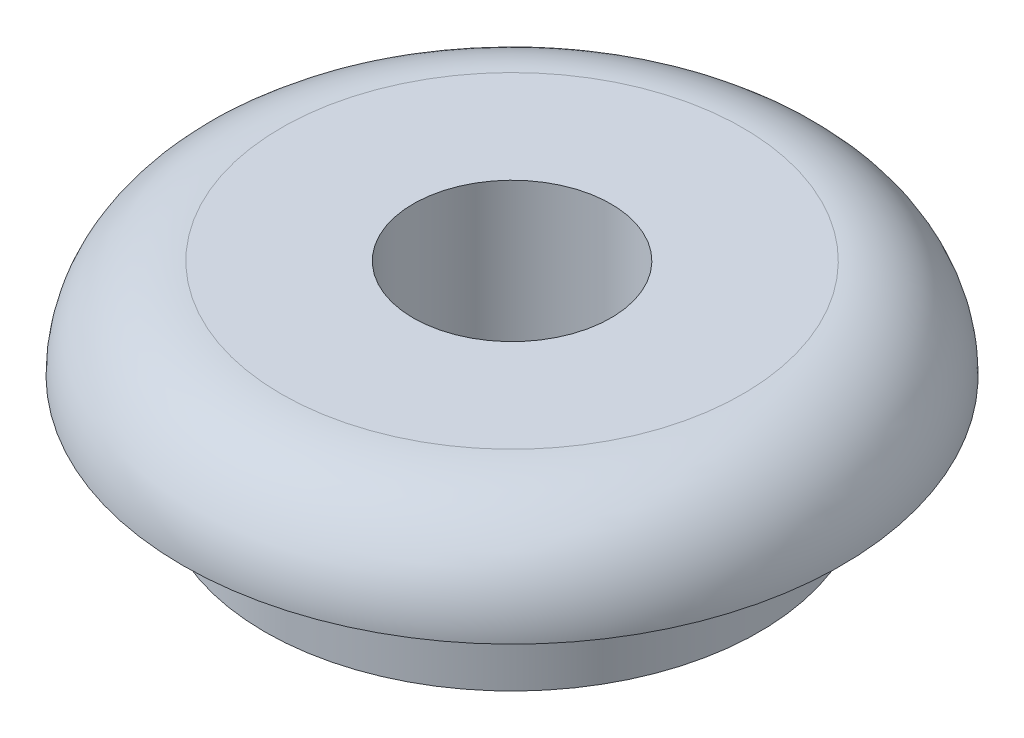
ISO-10303-21;
HEADER;
FILE_DESCRIPTION(('STEP AP214'),'2;1');
FILE_NAME('part.step','',(''),(''),'','','');
FILE_SCHEMA(('AUTOMOTIVE_DESIGN { 1 0 10303 214 1 1 1 1 }'));
ENDSEC;
DATA;
#1=APPLICATION_CONTEXT('core data for automotive mechanical design processes');
#2=APPLICATION_PROTOCOL_DEFINITION('international standard','automotive_design',2000,#1);
#3=PRODUCT_CONTEXT('',#1,'mechanical');
#4=PRODUCT('Part','Part','',(#3));
#5=PRODUCT_RELATED_PRODUCT_CATEGORY('part','',(#4));
#6=PRODUCT_DEFINITION_FORMATION('','',#4);
#7=PRODUCT_DEFINITION_CONTEXT('part definition',#1,'design');
#8=PRODUCT_DEFINITION('design','',#6,#7);
#9=PRODUCT_DEFINITION_SHAPE('','',#8);
#10=(LENGTH_UNIT() NAMED_UNIT(*) SI_UNIT(.MILLI.,.METRE.));
#11=(NAMED_UNIT(*) PLANE_ANGLE_UNIT() SI_UNIT($,.RADIAN.));
#12=(NAMED_UNIT(*) SI_UNIT($,.STERADIAN.) SOLID_ANGLE_UNIT());
#13=UNCERTAINTY_MEASURE_WITH_UNIT(LENGTH_MEASURE(1.E-05),#10,'distance_accuracy_value','');
#14=(GEOMETRIC_REPRESENTATION_CONTEXT(3) GLOBAL_UNCERTAINTY_ASSIGNED_CONTEXT((#13)) GLOBAL_UNIT_ASSIGNED_CONTEXT((#10,
#11,#12)) REPRESENTATION_CONTEXT('',''));
#15=CARTESIAN_POINT('',(0.,0.,0.));
#16=DIRECTION('',(0.,0.,1.));
#17=DIRECTION('',(1.,0.,0.));
#18=AXIS2_PLACEMENT_3D('',#15,#16,#17);
#19=CARTESIAN_POINT('',(0.,6.,0.));
#20=DIRECTION('',(0.,-1.,0.));
#21=DIRECTION('',(0.,0.,-1.));
#22=AXIS2_PLACEMENT_3D('',#19,#20,#21);
#23=CYLINDRICAL_SURFACE('',#22,7.5);
#24=CARTESIAN_POINT('',(0.,0.,0.));
#25=DIRECTION('',(0.,1.,0.));
#26=DIRECTION('',(0.,0.,1.));
#27=AXIS2_PLACEMENT_3D('',#24,#25,#26);
#28=CIRCLE('',#27,7.5);
#29=CARTESIAN_POINT('',(0.,0.,7.5));
#30=VERTEX_POINT('',#29);
#31=EDGE_CURVE('E48',#30,#30,#28,.T.);
#32=ORIENTED_EDGE('',*,*,#31,.T.);
#33=EDGE_LOOP('',(#32));
#34=FACE_BOUND('',#33,.T.);
#35=CARTESIAN_POINT('',(0.,3.,0.));
#36=DIRECTION('',(0.,1.,0.));
#37=DIRECTION('',(0.,0.,1.));
#38=AXIS2_PLACEMENT_3D('',#35,#36,#37);
#39=CIRCLE('',#38,7.5);
#40=CARTESIAN_POINT('',(0.,3.,7.5));
#41=VERTEX_POINT('',#40);
#42=EDGE_CURVE('E44',#41,#41,#39,.T.);
#43=ORIENTED_EDGE('',*,*,#42,.F.);
#44=EDGE_LOOP('',(#43));
#45=FACE_BOUND('',#44,.T.);
#46=ADVANCED_FACE('F37',(#34,#45),#23,.T.);
#47=CARTESIAN_POINT('',(0.,0.,0.));
#48=DIRECTION('',(0.,1.,0.));
#49=DIRECTION('',(0.,0.,1.));
#50=AXIS2_PLACEMENT_3D('',#47,#48,#49);
#51=PLANE('',#50);
#52=CARTESIAN_POINT('',(0.,0.,0.));
#53=DIRECTION('',(0.,1.,0.));
#54=DIRECTION('',(0.,0.,1.));
#55=AXIS2_PLACEMENT_3D('',#52,#53,#54);
#56=CIRCLE('',#55,3.);
#57=CARTESIAN_POINT('',(0.,0.,3.));
#58=VERTEX_POINT('',#57);
#59=EDGE_CURVE('E57',#58,#58,#56,.T.);
#60=ORIENTED_EDGE('',*,*,#59,.T.);
#61=EDGE_LOOP('',(#60));
#62=FACE_BOUND('',#61,.T.);
#63=ORIENTED_EDGE('',*,*,#31,.F.);
#64=EDGE_LOOP('',(#63));
#65=FACE_BOUND('',#64,.T.);
#66=ADVANCED_FACE('F64',(#62,#65),#51,.F.);
#67=CARTESIAN_POINT('',(0.,3.,0.));
#68=DIRECTION('',(0.,1.,0.));
#69=DIRECTION('',(0.,0.,1.));
#70=AXIS2_PLACEMENT_3D('',#67,#68,#69);
#71=PLANE('',#70);
#72=ORIENTED_EDGE('',*,*,#42,.T.);
#73=EDGE_LOOP('',(#72));
#74=FACE_BOUND('',#73,.T.);
#75=CARTESIAN_POINT('',(0.,3.,0.));
#76=DIRECTION('',(0.,1.,0.));
#77=DIRECTION('',(0.,0.,1.));
#78=AXIS2_PLACEMENT_3D('',#75,#76,#77);
#79=CIRCLE('',#78,10.);
#80=CARTESIAN_POINT('',(0.,3.,10.));
#81=VERTEX_POINT('',#80);
#82=EDGE_CURVE('E52',#81,#81,#79,.T.);
#83=ORIENTED_EDGE('',*,*,#82,.F.);
#84=EDGE_LOOP('',(#83));
#85=FACE_BOUND('',#84,.T.);
#86=ADVANCED_FACE('F75',(#74,#85),#71,.F.);
#87=CARTESIAN_POINT('',(0.,6.,0.));
#88=DIRECTION('',(0.,1.,0.));
#89=DIRECTION('',(0.,0.,1.));
#90=AXIS2_PLACEMENT_3D('',#87,#88,#89);
#91=PLANE('',#90);
#92=CARTESIAN_POINT('',(0.,6.,0.));
#93=DIRECTION('',(0.,1.,0.));
#94=DIRECTION('',(0.,0.,1.));
#95=AXIS2_PLACEMENT_3D('',#92,#93,#94);
#96=CIRCLE('',#95,3.);
#97=CARTESIAN_POINT('',(0.,6.,3.));
#98=VERTEX_POINT('',#97);
#99=EDGE_CURVE('E58',#98,#98,#96,.T.);
#100=ORIENTED_EDGE('',*,*,#99,.F.);
#101=EDGE_LOOP('',(#100));
#102=FACE_BOUND('',#101,.T.);
#103=CARTESIAN_POINT('',(0.,6.,0.));
#104=DIRECTION('',(0.,1.,0.));
#105=DIRECTION('',(0.,0.,1.));
#106=AXIS2_PLACEMENT_3D('',#103,#104,#105);
#107=CIRCLE('',#106,7.);
#108=CARTESIAN_POINT('',(0.,6.,7.));
#109=VERTEX_POINT('',#108);
#110=EDGE_CURVE('E10',#109,#109,#107,.T.);
#111=ORIENTED_EDGE('',*,*,#110,.T.);
#112=EDGE_LOOP('',(#111));
#113=FACE_BOUND('',#112,.T.);
#114=ADVANCED_FACE('F73',(#102,#113),#91,.T.);
#115=CARTESIAN_POINT('',(0.,3.,0.));
#116=DIRECTION('',(0.,1.,0.));
#117=DIRECTION('',(0.,0.,1.));
#118=AXIS2_PLACEMENT_3D('',#115,#116,#117);
#119=TOROIDAL_SURFACE('',#118,7.,3.);
#120=ORIENTED_EDGE('',*,*,#82,.T.);
#121=EDGE_LOOP('',(#120));
#122=FACE_BOUND('',#121,.T.);
#123=ORIENTED_EDGE('',*,*,#110,.F.);
#124=EDGE_LOOP('',(#123));
#125=FACE_BOUND('',#124,.T.);
#126=ADVANCED_FACE('F39',(#122,#125),#119,.T.);
#127=CARTESIAN_POINT('',(0.,0.,0.));
#128=DIRECTION('',(0.,1.,0.));
#129=DIRECTION('',(0.,0.,1.));
#130=AXIS2_PLACEMENT_3D('',#127,#128,#129);
#131=CYLINDRICAL_SURFACE('',#130,3.);
#132=ORIENTED_EDGE('',*,*,#59,.F.);
#133=EDGE_LOOP('',(#132));
#134=FACE_BOUND('',#133,.T.);
#135=ORIENTED_EDGE('',*,*,#99,.T.);
#136=EDGE_LOOP('',(#135));
#137=FACE_BOUND('',#136,.T.);
#138=ADVANCED_FACE('F67',(#134,#137),#131,.F.);
#139=CLOSED_SHELL('',(#46,#66,#86,#114,#126,#138));
#140=MANIFOLD_SOLID_BREP('B2',#139);
#141=ADVANCED_BREP_SHAPE_REPRESENTATION('',(#18,#140),#14);
#142=SHAPE_DEFINITION_REPRESENTATION(#9,#141);
ENDSEC;
END-ISO-10303-21;
